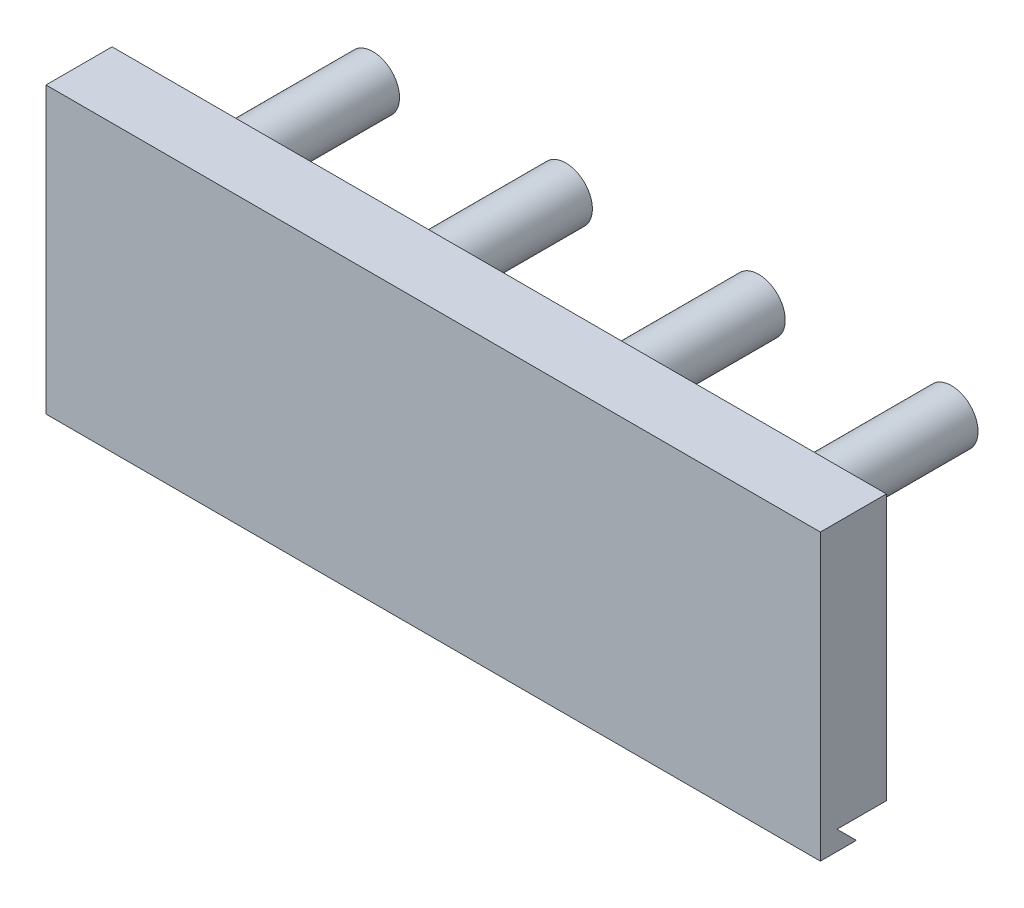
ISO-10303-21;
HEADER;
FILE_DESCRIPTION(('STEP AP214'),'2;1');
FILE_NAME('part.step','',(''),(''),'','','');
FILE_SCHEMA(('AUTOMOTIVE_DESIGN { 1 0 10303 214 1 1 1 1 }'));
ENDSEC;
DATA;
#1=APPLICATION_CONTEXT('core data for automotive mechanical design processes');
#2=APPLICATION_PROTOCOL_DEFINITION('international standard','automotive_design',2000,#1);
#3=PRODUCT_CONTEXT('',#1,'mechanical');
#4=PRODUCT('Part','Part','',(#3));
#5=PRODUCT_RELATED_PRODUCT_CATEGORY('part','',(#4));
#6=PRODUCT_DEFINITION_FORMATION('','',#4);
#7=PRODUCT_DEFINITION_CONTEXT('part definition',#1,'design');
#8=PRODUCT_DEFINITION('design','',#6,#7);
#9=PRODUCT_DEFINITION_SHAPE('','',#8);
#10=(LENGTH_UNIT() NAMED_UNIT(*) SI_UNIT(.MILLI.,.METRE.));
#11=(NAMED_UNIT(*) PLANE_ANGLE_UNIT() SI_UNIT($,.RADIAN.));
#12=(NAMED_UNIT(*) SI_UNIT($,.STERADIAN.) SOLID_ANGLE_UNIT());
#13=UNCERTAINTY_MEASURE_WITH_UNIT(LENGTH_MEASURE(1.E-05),#10,'distance_accuracy_value','');
#14=(GEOMETRIC_REPRESENTATION_CONTEXT(3) GLOBAL_UNCERTAINTY_ASSIGNED_CONTEXT((#13)) GLOBAL_UNIT_ASSIGNED_CONTEXT((#10,
#11,#12)) REPRESENTATION_CONTEXT('',''));
#15=CARTESIAN_POINT('',(0.,0.,0.));
#16=DIRECTION('',(0.,0.,1.));
#17=DIRECTION('',(1.,0.,0.));
#18=AXIS2_PLACEMENT_3D('',#15,#16,#17);
#19=CARTESIAN_POINT('',(51.,-17.5,8.7));
#20=DIRECTION('',(-1.,0.,0.));
#21=DIRECTION('',(0.,0.,1.));
#22=AXIS2_PLACEMENT_3D('',#19,#20,#21);
#23=PLANE('',#22);
#24=DIRECTION('',(0.,1.,0.));
#25=VECTOR('',#24,1.);
#26=CARTESIAN_POINT('',(51.,-17.5,0.));
#27=LINE('',#26,#25);
#28=CARTESIAN_POINT('',(51.,-17.5,0.));
#29=VERTEX_POINT('',#28);
#30=CARTESIAN_POINT('',(51.,17.5,0.));
#31=VERTEX_POINT('',#30);
#32=EDGE_CURVE('E86',#29,#31,#27,.T.);
#33=ORIENTED_EDGE('',*,*,#32,.T.);
#34=DIRECTION('',(0.,0.,-1.));
#35=VECTOR('',#34,1.);
#36=CARTESIAN_POINT('',(51.,17.5,8.7));
#37=LINE('',#36,#35);
#38=CARTESIAN_POINT('',(51.,17.5,8.7));
#39=VERTEX_POINT('',#38);
#40=EDGE_CURVE('E11',#39,#31,#37,.T.);
#41=ORIENTED_EDGE('',*,*,#40,.F.);
#42=DIRECTION('',(0.,1.,0.));
#43=VECTOR('',#42,1.);
#44=CARTESIAN_POINT('',(51.,-17.5,8.7));
#45=LINE('',#44,#43);
#46=CARTESIAN_POINT('',(51.,-20.0455844122716,8.7));
#47=VERTEX_POINT('',#46);
#48=EDGE_CURVE('E102',#47,#39,#45,.T.);
#49=ORIENTED_EDGE('',*,*,#48,.F.);
#50=DIRECTION('',(0.,0.,1.));
#51=VECTOR('',#50,1.);
#52=CARTESIAN_POINT('',(51.,-20.0455844122716,8.7));
#53=LINE('',#52,#51);
#54=CARTESIAN_POINT('',(51.,-20.0455844122716,3.95441558772844));
#55=VERTEX_POINT('',#54);
#56=EDGE_CURVE('E128',#55,#47,#53,.T.);
#57=ORIENTED_EDGE('',*,*,#56,.F.);
#58=DIRECTION('',(0.,-0.707106781186549,-0.707106781186546));
#59=VECTOR('',#58,1.);
#60=CARTESIAN_POINT('',(51.,-20.0455844122716,3.95441558772844));
#61=LINE('',#60,#59);
#62=CARTESIAN_POINT('',(51.,-17.5,6.5));
#63=VERTEX_POINT('',#62);
#64=EDGE_CURVE('E90',#63,#55,#61,.T.);
#65=ORIENTED_EDGE('',*,*,#64,.F.);
#66=DIRECTION('',(0.,0.,-1.));
#67=VECTOR('',#66,1.);
#68=CARTESIAN_POINT('',(51.,-17.5,8.7));
#69=LINE('',#68,#67);
#70=EDGE_CURVE('E82',#63,#29,#69,.T.);
#71=ORIENTED_EDGE('',*,*,#70,.T.);
#72=EDGE_LOOP('',(#33,#41,#49,#57,#65,#71));
#73=FACE_BOUND('',#72,.T.);
#74=ADVANCED_FACE('F39',(#73),#23,.F.);
#75=CARTESIAN_POINT('',(-51.,17.5,8.7));
#76=DIRECTION('',(0.,-1.,0.));
#77=DIRECTION('',(0.,0.,-1.));
#78=AXIS2_PLACEMENT_3D('',#75,#76,#77);
#79=PLANE('',#78);
#80=DIRECTION('',(-1.,0.,0.));
#81=VECTOR('',#80,1.);
#82=CARTESIAN_POINT('',(-51.,17.5,0.));
#83=LINE('',#82,#81);
#84=CARTESIAN_POINT('',(-51.,17.5,0.));
#85=VERTEX_POINT('',#84);
#86=EDGE_CURVE('E106',#31,#85,#83,.T.);
#87=ORIENTED_EDGE('',*,*,#86,.T.);
#88=DIRECTION('',(0.,0.,-1.));
#89=VECTOR('',#88,1.);
#90=CARTESIAN_POINT('',(-51.,17.5,8.7));
#91=LINE('',#90,#89);
#92=CARTESIAN_POINT('',(-51.,17.5,8.7));
#93=VERTEX_POINT('',#92);
#94=EDGE_CURVE('E46',#93,#85,#91,.T.);
#95=ORIENTED_EDGE('',*,*,#94,.F.);
#96=DIRECTION('',(-1.,0.,0.));
#97=VECTOR('',#96,1.);
#98=CARTESIAN_POINT('',(-51.,17.5,8.7));
#99=LINE('',#98,#97);
#100=EDGE_CURVE('E62',#39,#93,#99,.T.);
#101=ORIENTED_EDGE('',*,*,#100,.F.);
#102=ORIENTED_EDGE('',*,*,#40,.T.);
#103=EDGE_LOOP('',(#87,#95,#101,#102));
#104=FACE_BOUND('',#103,.T.);
#105=ADVANCED_FACE('F123',(#104),#79,.F.);
#106=CARTESIAN_POINT('',(-51.,-17.5,8.7));
#107=DIRECTION('',(1.,0.,0.));
#108=DIRECTION('',(0.,0.,-1.));
#109=AXIS2_PLACEMENT_3D('',#106,#107,#108);
#110=PLANE('',#109);
#111=DIRECTION('',(0.,-1.,0.));
#112=VECTOR('',#111,1.);
#113=CARTESIAN_POINT('',(-51.,-17.5,0.));
#114=LINE('',#113,#112);
#115=CARTESIAN_POINT('',(-51.,-17.5,0.));
#116=VERTEX_POINT('',#115);
#117=EDGE_CURVE('E103',#85,#116,#114,.T.);
#118=ORIENTED_EDGE('',*,*,#117,.T.);
#119=DIRECTION('',(0.,0.,-1.));
#120=VECTOR('',#119,1.);
#121=CARTESIAN_POINT('',(-51.,-17.5,8.7));
#122=LINE('',#121,#120);
#123=CARTESIAN_POINT('',(-51.,-17.5,6.5));
#124=VERTEX_POINT('',#123);
#125=EDGE_CURVE('E92',#124,#116,#122,.T.);
#126=ORIENTED_EDGE('',*,*,#125,.F.);
#127=DIRECTION('',(0.,-0.707106781186549,-0.707106781186546));
#128=VECTOR('',#127,1.);
#129=CARTESIAN_POINT('',(-51.,-20.0455844122716,3.95441558772844));
#130=LINE('',#129,#128);
#131=CARTESIAN_POINT('',(-51.,-20.0455844122716,3.95441558772844));
#132=VERTEX_POINT('',#131);
#133=EDGE_CURVE('E53',#124,#132,#130,.T.);
#134=ORIENTED_EDGE('',*,*,#133,.T.);
#135=DIRECTION('',(0.,0.,1.));
#136=VECTOR('',#135,1.);
#137=CARTESIAN_POINT('',(-51.,-20.0455844122716,8.7));
#138=LINE('',#137,#136);
#139=CARTESIAN_POINT('',(-51.,-20.0455844122716,8.7));
#140=VERTEX_POINT('',#139);
#141=EDGE_CURVE('E140',#132,#140,#138,.T.);
#142=ORIENTED_EDGE('',*,*,#141,.T.);
#143=DIRECTION('',(0.,-1.,0.));
#144=VECTOR('',#143,1.);
#145=CARTESIAN_POINT('',(-51.,-17.5,8.7));
#146=LINE('',#145,#144);
#147=EDGE_CURVE('E93',#93,#140,#146,.T.);
#148=ORIENTED_EDGE('',*,*,#147,.F.);
#149=ORIENTED_EDGE('',*,*,#94,.T.);
#150=EDGE_LOOP('',(#118,#126,#134,#142,#148,#149));
#151=FACE_BOUND('',#150,.T.);
#152=ADVANCED_FACE('F120',(#151),#110,.F.);
#153=CARTESIAN_POINT('',(-51.,-17.5,8.7));
#154=DIRECTION('',(0.,1.,0.));
#155=DIRECTION('',(0.,0.,1.));
#156=AXIS2_PLACEMENT_3D('',#153,#154,#155);
#157=PLANE('',#156);
#158=ORIENTED_EDGE('',*,*,#70,.F.);
#159=DIRECTION('',(-1.,0.,0.));
#160=VECTOR('',#159,1.);
#161=CARTESIAN_POINT('',(51.,-17.5,6.5));
#162=LINE('',#161,#160);
#163=EDGE_CURVE('E137',#63,#124,#162,.T.);
#164=ORIENTED_EDGE('',*,*,#163,.T.);
#165=ORIENTED_EDGE('',*,*,#125,.T.);
#166=DIRECTION('',(1.,0.,0.));
#167=VECTOR('',#166,1.);
#168=CARTESIAN_POINT('',(-51.,-17.5,0.));
#169=LINE('',#168,#167);
#170=EDGE_CURVE('E96',#116,#29,#169,.T.);
#171=ORIENTED_EDGE('',*,*,#170,.T.);
#172=EDGE_LOOP('',(#158,#164,#165,#171));
#173=FACE_BOUND('',#172,.T.);
#174=ADVANCED_FACE('F97',(#173),#157,.F.);
#175=CARTESIAN_POINT('',(0.,0.,8.7));
#176=DIRECTION('',(0.,0.,-1.));
#177=DIRECTION('',(-1.,0.,0.));
#178=AXIS2_PLACEMENT_3D('',#175,#176,#177);
#179=PLANE('',#178);
#180=ORIENTED_EDGE('',*,*,#48,.T.);
#181=ORIENTED_EDGE('',*,*,#100,.T.);
#182=ORIENTED_EDGE('',*,*,#147,.T.);
#183=DIRECTION('',(-1.,0.,0.));
#184=VECTOR('',#183,1.);
#185=CARTESIAN_POINT('',(51.,-20.0455844122716,8.7));
#186=LINE('',#185,#184);
#187=EDGE_CURVE('E107',#47,#140,#186,.T.);
#188=ORIENTED_EDGE('',*,*,#187,.F.);
#189=EDGE_LOOP('',(#180,#181,#182,#188));
#190=FACE_BOUND('',#189,.T.);
#191=ADVANCED_FACE('F131',(#190),#179,.F.);
#192=CARTESIAN_POINT('',(0.,0.,0.));
#193=DIRECTION('',(0.,0.,-1.));
#194=DIRECTION('',(-1.,0.,0.));
#195=AXIS2_PLACEMENT_3D('',#192,#193,#194);
#196=PLANE('',#195);
#197=CARTESIAN_POINT('',(-36.63,10.64,0.));
#198=DIRECTION('',(0.,0.,-1.));
#199=DIRECTION('',(-1.,0.,0.));
#200=AXIS2_PLACEMENT_3D('',#197,#198,#199);
#201=CIRCLE('',#200,3.5);
#202=CARTESIAN_POINT('',(-40.13,10.64,0.));
#203=VERTEX_POINT('',#202);
#204=EDGE_CURVE('E275',#203,#203,#201,.T.);
#205=ORIENTED_EDGE('',*,*,#204,.F.);
#206=EDGE_LOOP('',(#205));
#207=FACE_BOUND('',#206,.T.);
#208=CARTESIAN_POINT('',(-11.23,10.64,0.));
#209=DIRECTION('',(0.,0.,-1.));
#210=DIRECTION('',(-1.,0.,0.));
#211=AXIS2_PLACEMENT_3D('',#208,#209,#210);
#212=CIRCLE('',#211,3.5);
#213=CARTESIAN_POINT('',(-14.73,10.64,0.));
#214=VERTEX_POINT('',#213);
#215=EDGE_CURVE('E281',#214,#214,#212,.T.);
#216=ORIENTED_EDGE('',*,*,#215,.F.);
#217=EDGE_LOOP('',(#216));
#218=FACE_BOUND('',#217,.T.);
#219=CARTESIAN_POINT('',(14.17,10.64,0.));
#220=DIRECTION('',(0.,0.,-1.));
#221=DIRECTION('',(-1.,0.,0.));
#222=AXIS2_PLACEMENT_3D('',#219,#220,#221);
#223=CIRCLE('',#222,3.5);
#224=CARTESIAN_POINT('',(10.67,10.64,0.));
#225=VERTEX_POINT('',#224);
#226=EDGE_CURVE('E287',#225,#225,#223,.T.);
#227=ORIENTED_EDGE('',*,*,#226,.F.);
#228=EDGE_LOOP('',(#227));
#229=FACE_BOUND('',#228,.T.);
#230=CARTESIAN_POINT('',(39.57,10.64,0.));
#231=DIRECTION('',(0.,0.,-1.));
#232=DIRECTION('',(-1.,0.,0.));
#233=AXIS2_PLACEMENT_3D('',#230,#231,#232);
#234=CIRCLE('',#233,3.5);
#235=CARTESIAN_POINT('',(36.07,10.64,0.));
#236=VERTEX_POINT('',#235);
#237=EDGE_CURVE('E290',#236,#236,#234,.T.);
#238=ORIENTED_EDGE('',*,*,#237,.F.);
#239=EDGE_LOOP('',(#238));
#240=FACE_BOUND('',#239,.T.);
#241=ORIENTED_EDGE('',*,*,#32,.F.);
#242=ORIENTED_EDGE('',*,*,#170,.F.);
#243=ORIENTED_EDGE('',*,*,#117,.F.);
#244=ORIENTED_EDGE('',*,*,#86,.F.);
#245=EDGE_LOOP('',(#241,#242,#243,#244));
#246=FACE_BOUND('',#245,.T.);
#247=ADVANCED_FACE('F105',(#207,#218,#229,#240,#246),#196,.T.);
#248=CARTESIAN_POINT('',(51.,-20.0455844122716,8.7));
#249=DIRECTION('',(0.,-1.,0.));
#250=DIRECTION('',(0.,0.,-1.));
#251=AXIS2_PLACEMENT_3D('',#248,#249,#250);
#252=PLANE('',#251);
#253=ORIENTED_EDGE('',*,*,#141,.F.);
#254=DIRECTION('',(-1.,0.,0.));
#255=VECTOR('',#254,1.);
#256=CARTESIAN_POINT('',(51.,-20.0455844122716,3.95441558772844));
#257=LINE('',#256,#255);
#258=EDGE_CURVE('E111',#55,#132,#257,.T.);
#259=ORIENTED_EDGE('',*,*,#258,.F.);
#260=ORIENTED_EDGE('',*,*,#56,.T.);
#261=ORIENTED_EDGE('',*,*,#187,.T.);
#262=EDGE_LOOP('',(#253,#259,#260,#261));
#263=FACE_BOUND('',#262,.T.);
#264=ADVANCED_FACE('F136',(#263),#252,.T.);
#265=CARTESIAN_POINT('',(51.,-20.0455844122716,3.95441558772844));
#266=DIRECTION('',(0.,0.707106781186546,-0.707106781186549));
#267=DIRECTION('',(0.,0.707106781186549,0.707106781186546));
#268=AXIS2_PLACEMENT_3D('',#265,#266,#267);
#269=PLANE('',#268);
#270=ORIENTED_EDGE('',*,*,#133,.F.);
#271=ORIENTED_EDGE('',*,*,#163,.F.);
#272=ORIENTED_EDGE('',*,*,#64,.T.);
#273=ORIENTED_EDGE('',*,*,#258,.T.);
#274=EDGE_LOOP('',(#270,#271,#272,#273));
#275=FACE_BOUND('',#274,.T.);
#276=ADVANCED_FACE('F148',(#275),#269,.T.);
#277=CARTESIAN_POINT('',(39.57,10.64,-20.));
#278=DIRECTION('',(0.,0.,1.));
#279=DIRECTION('',(1.,0.,0.));
#280=AXIS2_PLACEMENT_3D('',#277,#278,#279);
#281=CYLINDRICAL_SURFACE('',#280,3.5);
#282=CARTESIAN_POINT('',(39.57,10.64,-20.));
#283=DIRECTION('',(0.,0.,-1.));
#284=DIRECTION('',(-1.,0.,0.));
#285=AXIS2_PLACEMENT_3D('',#282,#283,#284);
#286=CIRCLE('',#285,3.5);
#287=CARTESIAN_POINT('',(36.07,10.64,-20.));
#288=VERTEX_POINT('',#287);
#289=EDGE_CURVE('E145',#288,#288,#286,.T.);
#290=ORIENTED_EDGE('',*,*,#289,.F.);
#291=EDGE_LOOP('',(#290));
#292=FACE_BOUND('',#291,.T.);
#293=ORIENTED_EDGE('',*,*,#237,.T.);
#294=EDGE_LOOP('',(#293));
#295=FACE_BOUND('',#294,.T.);
#296=ADVANCED_FACE('F153',(#292,#295),#281,.T.);
#297=CARTESIAN_POINT('',(39.57,10.64,-20.));
#298=DIRECTION('',(0.,0.,-1.));
#299=DIRECTION('',(-1.,0.,0.));
#300=AXIS2_PLACEMENT_3D('',#297,#298,#299);
#301=PLANE('',#300);
#302=ORIENTED_EDGE('',*,*,#289,.T.);
#303=EDGE_LOOP('',(#302));
#304=FACE_BOUND('',#303,.T.);
#305=ADVANCED_FACE('F160',(#304),#301,.T.);
#306=CARTESIAN_POINT('',(14.17,10.64,-20.));
#307=DIRECTION('',(0.,0.,1.));
#308=DIRECTION('',(1.,0.,0.));
#309=AXIS2_PLACEMENT_3D('',#306,#307,#308);
#310=CYLINDRICAL_SURFACE('',#309,3.5);
#311=CARTESIAN_POINT('',(14.17,10.64,-20.));
#312=DIRECTION('',(0.,0.,-1.));
#313=DIRECTION('',(-1.,0.,0.));
#314=AXIS2_PLACEMENT_3D('',#311,#312,#313);
#315=CIRCLE('',#314,3.5);
#316=CARTESIAN_POINT('',(10.67,10.64,-20.));
#317=VERTEX_POINT('',#316);
#318=EDGE_CURVE('E284',#317,#317,#315,.T.);
#319=ORIENTED_EDGE('',*,*,#318,.F.);
#320=EDGE_LOOP('',(#319));
#321=FACE_BOUND('',#320,.T.);
#322=ORIENTED_EDGE('',*,*,#226,.T.);
#323=EDGE_LOOP('',(#322));
#324=FACE_BOUND('',#323,.T.);
#325=ADVANCED_FACE('F209',(#321,#324),#310,.T.);
#326=CARTESIAN_POINT('',(14.17,10.64,-20.));
#327=DIRECTION('',(0.,0.,-1.));
#328=DIRECTION('',(-1.,0.,0.));
#329=AXIS2_PLACEMENT_3D('',#326,#327,#328);
#330=PLANE('',#329);
#331=ORIENTED_EDGE('',*,*,#318,.T.);
#332=EDGE_LOOP('',(#331));
#333=FACE_BOUND('',#332,.T.);
#334=ADVANCED_FACE('F219',(#333),#330,.T.);
#335=CARTESIAN_POINT('',(-11.23,10.64,-20.));
#336=DIRECTION('',(0.,0.,1.));
#337=DIRECTION('',(1.,0.,0.));
#338=AXIS2_PLACEMENT_3D('',#335,#336,#337);
#339=CYLINDRICAL_SURFACE('',#338,3.5);
#340=CARTESIAN_POINT('',(-11.23,10.64,-20.));
#341=DIRECTION('',(0.,0.,-1.));
#342=DIRECTION('',(-1.,0.,0.));
#343=AXIS2_PLACEMENT_3D('',#340,#341,#342);
#344=CIRCLE('',#343,3.5);
#345=CARTESIAN_POINT('',(-14.73,10.64,-20.));
#346=VERTEX_POINT('',#345);
#347=EDGE_CURVE('E278',#346,#346,#344,.T.);
#348=ORIENTED_EDGE('',*,*,#347,.F.);
#349=EDGE_LOOP('',(#348));
#350=FACE_BOUND('',#349,.T.);
#351=ORIENTED_EDGE('',*,*,#215,.T.);
#352=EDGE_LOOP('',(#351));
#353=FACE_BOUND('',#352,.T.);
#354=ADVANCED_FACE('F229',(#350,#353),#339,.T.);
#355=CARTESIAN_POINT('',(-11.23,10.64,-20.));
#356=DIRECTION('',(0.,0.,-1.));
#357=DIRECTION('',(-1.,0.,0.));
#358=AXIS2_PLACEMENT_3D('',#355,#356,#357);
#359=PLANE('',#358);
#360=ORIENTED_EDGE('',*,*,#347,.T.);
#361=EDGE_LOOP('',(#360));
#362=FACE_BOUND('',#361,.T.);
#363=ADVANCED_FACE('F239',(#362),#359,.T.);
#364=CARTESIAN_POINT('',(-36.63,10.64,-20.));
#365=DIRECTION('',(0.,0.,1.));
#366=DIRECTION('',(1.,0.,0.));
#367=AXIS2_PLACEMENT_3D('',#364,#365,#366);
#368=CYLINDRICAL_SURFACE('',#367,3.5);
#369=CARTESIAN_POINT('',(-36.63,10.64,-20.));
#370=DIRECTION('',(0.,0.,-1.));
#371=DIRECTION('',(-1.,0.,0.));
#372=AXIS2_PLACEMENT_3D('',#369,#370,#371);
#373=CIRCLE('',#372,3.5);
#374=CARTESIAN_POINT('',(-40.13,10.64,-20.));
#375=VERTEX_POINT('',#374);
#376=EDGE_CURVE('E274',#375,#375,#373,.T.);
#377=ORIENTED_EDGE('',*,*,#376,.F.);
#378=EDGE_LOOP('',(#377));
#379=FACE_BOUND('',#378,.T.);
#380=ORIENTED_EDGE('',*,*,#204,.T.);
#381=EDGE_LOOP('',(#380));
#382=FACE_BOUND('',#381,.T.);
#383=ADVANCED_FACE('F249',(#379,#382),#368,.T.);
#384=CARTESIAN_POINT('',(-36.63,10.64,-20.));
#385=DIRECTION('',(0.,0.,-1.));
#386=DIRECTION('',(-1.,0.,0.));
#387=AXIS2_PLACEMENT_3D('',#384,#385,#386);
#388=PLANE('',#387);
#389=ORIENTED_EDGE('',*,*,#376,.T.);
#390=EDGE_LOOP('',(#389));
#391=FACE_BOUND('',#390,.T.);
#392=ADVANCED_FACE('F259',(#391),#388,.T.);
#393=CLOSED_SHELL('',(#74,#105,#152,#174,#191,#247,#264,#276,#296,#305,#325,#334,#354,#363,#383,#392));
#394=MANIFOLD_SOLID_BREP('B2',#393);
#395=ADVANCED_BREP_SHAPE_REPRESENTATION('',(#18,#394),#14);
#396=SHAPE_DEFINITION_REPRESENTATION(#9,#395);
ENDSEC;
END-ISO-10303-21;
